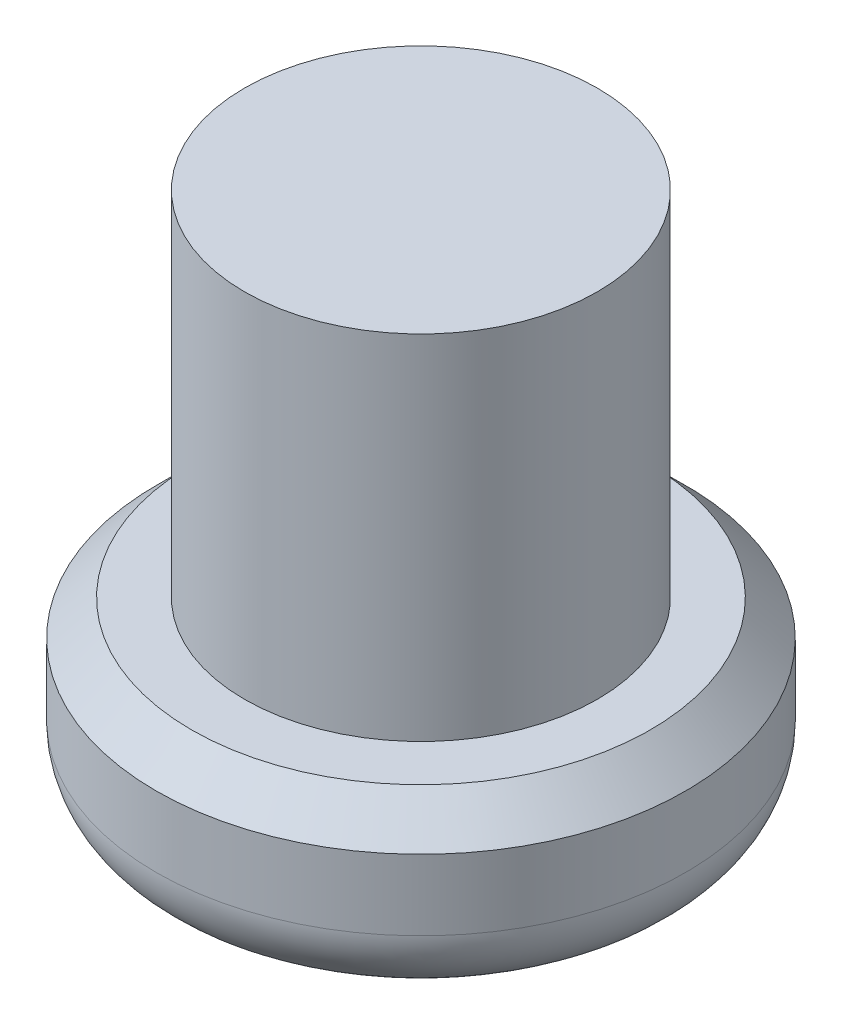
ISO-10303-21;
HEADER;
FILE_DESCRIPTION(('STEP AP214'),'2;1');
FILE_NAME('part.step','',(''),(''),'','','');
FILE_SCHEMA(('AUTOMOTIVE_DESIGN { 1 0 10303 214 1 1 1 1 }'));
ENDSEC;
DATA;
#1=APPLICATION_CONTEXT('core data for automotive mechanical design processes');
#2=APPLICATION_PROTOCOL_DEFINITION('international standard','automotive_design',2000,#1);
#3=PRODUCT_CONTEXT('',#1,'mechanical');
#4=PRODUCT('Part','Part','',(#3));
#5=PRODUCT_RELATED_PRODUCT_CATEGORY('part','',(#4));
#6=PRODUCT_DEFINITION_FORMATION('','',#4);
#7=PRODUCT_DEFINITION_CONTEXT('part definition',#1,'design');
#8=PRODUCT_DEFINITION('design','',#6,#7);
#9=PRODUCT_DEFINITION_SHAPE('','',#8);
#10=(LENGTH_UNIT() NAMED_UNIT(*) SI_UNIT(.MILLI.,.METRE.));
#11=(NAMED_UNIT(*) PLANE_ANGLE_UNIT() SI_UNIT($,.RADIAN.));
#12=(NAMED_UNIT(*) SI_UNIT($,.STERADIAN.) SOLID_ANGLE_UNIT());
#13=UNCERTAINTY_MEASURE_WITH_UNIT(LENGTH_MEASURE(1.E-05),#10,'distance_accuracy_value','');
#14=(GEOMETRIC_REPRESENTATION_CONTEXT(3) GLOBAL_UNCERTAINTY_ASSIGNED_CONTEXT((#13)) GLOBAL_UNIT_ASSIGNED_CONTEXT((#10,
#11,#12)) REPRESENTATION_CONTEXT('',''));
#15=CARTESIAN_POINT('',(0.,0.,0.));
#16=DIRECTION('',(0.,0.,1.));
#17=DIRECTION('',(1.,0.,0.));
#18=AXIS2_PLACEMENT_3D('',#15,#16,#17);
#19=CARTESIAN_POINT('',(0.,5.,0.));
#20=DIRECTION('',(0.,-1.,0.));
#21=DIRECTION('',(0.,0.,-1.));
#22=AXIS2_PLACEMENT_3D('',#19,#20,#21);
#23=CYLINDRICAL_SURFACE('',#22,7.5);
#24=CARTESIAN_POINT('',(0.,3.99999999999999,0.));
#25=DIRECTION('',(0.,1.,0.));
#26=DIRECTION('',(0.,0.,1.));
#27=AXIS2_PLACEMENT_3D('',#24,#25,#26);
#28=CIRCLE('',#27,7.5);
#29=CARTESIAN_POINT('',(0.,3.99999999999999,7.5));
#30=VERTEX_POINT('',#29);
#31=EDGE_CURVE('E10',#30,#30,#28,.F.);
#32=ORIENTED_EDGE('',*,*,#31,.T.);
#33=EDGE_LOOP('',(#32));
#34=FACE_BOUND('',#33,.T.);
#35=CARTESIAN_POINT('',(0.,2.,0.));
#36=DIRECTION('',(0.,1.,0.));
#37=DIRECTION('',(0.,0.,1.));
#38=AXIS2_PLACEMENT_3D('',#35,#36,#37);
#39=CIRCLE('',#38,7.5);
#40=CARTESIAN_POINT('',(0.,2.,7.5));
#41=VERTEX_POINT('',#40);
#42=EDGE_CURVE('E52',#41,#41,#39,.T.);
#43=ORIENTED_EDGE('',*,*,#42,.T.);
#44=EDGE_LOOP('',(#43));
#45=FACE_BOUND('',#44,.T.);
#46=ADVANCED_FACE('F37',(#34,#45),#23,.T.);
#47=CARTESIAN_POINT('',(0.,5.,0.));
#48=DIRECTION('',(0.,1.,0.));
#49=DIRECTION('',(0.,0.,1.));
#50=AXIS2_PLACEMENT_3D('',#47,#48,#49);
#51=PLANE('',#50);
#52=CARTESIAN_POINT('',(0.,5.,0.));
#53=DIRECTION('',(0.,1.,0.));
#54=DIRECTION('',(0.,0.,1.));
#55=AXIS2_PLACEMENT_3D('',#52,#53,#54);
#56=CIRCLE('',#55,6.49999999999999);
#57=CARTESIAN_POINT('',(0.,5.,6.49999999999999));
#58=VERTEX_POINT('',#57);
#59=EDGE_CURVE('E44',#58,#58,#56,.T.);
#60=ORIENTED_EDGE('',*,*,#59,.T.);
#61=EDGE_LOOP('',(#60));
#62=FACE_BOUND('',#61,.T.);
#63=CARTESIAN_POINT('',(0.,5.,0.));
#64=DIRECTION('',(0.,1.,0.));
#65=DIRECTION('',(0.,0.,1.));
#66=AXIS2_PLACEMENT_3D('',#63,#64,#65);
#67=CIRCLE('',#66,5.);
#68=CARTESIAN_POINT('',(0.,5.,5.));
#69=VERTEX_POINT('',#68);
#70=EDGE_CURVE('E58',#69,#69,#67,.T.);
#71=ORIENTED_EDGE('',*,*,#70,.F.);
#72=EDGE_LOOP('',(#71));
#73=FACE_BOUND('',#72,.T.);
#74=ADVANCED_FACE('F73',(#62,#73),#51,.T.);
#75=CARTESIAN_POINT('',(0.,0.,0.));
#76=DIRECTION('',(0.,1.,0.));
#77=DIRECTION('',(0.,0.,1.));
#78=AXIS2_PLACEMENT_3D('',#75,#76,#77);
#79=PLANE('',#78);
#80=CARTESIAN_POINT('',(0.,0.,0.));
#81=DIRECTION('',(0.,1.,0.));
#82=DIRECTION('',(0.,0.,1.));
#83=AXIS2_PLACEMENT_3D('',#80,#81,#82);
#84=CIRCLE('',#83,5.5);
#85=CARTESIAN_POINT('',(0.,0.,5.5));
#86=VERTEX_POINT('',#85);
#87=EDGE_CURVE('E48',#86,#86,#84,.F.);
#88=ORIENTED_EDGE('',*,*,#87,.T.);
#89=EDGE_LOOP('',(#88));
#90=FACE_BOUND('',#89,.T.);
#91=ADVANCED_FACE('F75',(#90),#79,.F.);
#92=CARTESIAN_POINT('',(0.,2.,0.));
#93=DIRECTION('',(0.,1.,0.));
#94=DIRECTION('',(0.,0.,1.));
#95=AXIS2_PLACEMENT_3D('',#92,#93,#94);
#96=TOROIDAL_SURFACE('',#95,5.5,2.);
#97=ORIENTED_EDGE('',*,*,#87,.F.);
#98=EDGE_LOOP('',(#97));
#99=FACE_BOUND('',#98,.T.);
#100=ORIENTED_EDGE('',*,*,#42,.F.);
#101=EDGE_LOOP('',(#100));
#102=FACE_BOUND('',#101,.T.);
#103=ADVANCED_FACE('F69',(#99,#102),#96,.T.);
#104=CARTESIAN_POINT('',(0.,15.,0.));
#105=DIRECTION('',(0.,-1.,0.));
#106=DIRECTION('',(0.,0.,-1.));
#107=AXIS2_PLACEMENT_3D('',#104,#105,#106);
#108=CYLINDRICAL_SURFACE('',#107,5.);
#109=CARTESIAN_POINT('',(0.,15.,0.));
#110=DIRECTION('',(0.,1.,0.));
#111=DIRECTION('',(0.,0.,1.));
#112=AXIS2_PLACEMENT_3D('',#109,#110,#111);
#113=CIRCLE('',#112,5.);
#114=CARTESIAN_POINT('',(0.,15.,5.));
#115=VERTEX_POINT('',#114);
#116=EDGE_CURVE('E57',#115,#115,#113,.T.);
#117=ORIENTED_EDGE('',*,*,#116,.F.);
#118=EDGE_LOOP('',(#117));
#119=FACE_BOUND('',#118,.T.);
#120=ORIENTED_EDGE('',*,*,#70,.T.);
#121=EDGE_LOOP('',(#120));
#122=FACE_BOUND('',#121,.T.);
#123=ADVANCED_FACE('F66',(#119,#122),#108,.T.);
#124=CARTESIAN_POINT('',(0.,15.,0.));
#125=DIRECTION('',(0.,1.,0.));
#126=DIRECTION('',(0.,0.,1.));
#127=AXIS2_PLACEMENT_3D('',#124,#125,#126);
#128=PLANE('',#127);
#129=ORIENTED_EDGE('',*,*,#116,.T.);
#130=EDGE_LOOP('',(#129));
#131=FACE_BOUND('',#130,.T.);
#132=ADVANCED_FACE('F64',(#131),#128,.T.);
#133=CARTESIAN_POINT('',(0.,5.,0.));
#134=DIRECTION('',(0.,-1.,0.));
#135=DIRECTION('',(0.,0.,-1.));
#136=AXIS2_PLACEMENT_3D('',#133,#134,#135);
#137=CONICAL_SURFACE('',#136,6.49999999999999,0.785398163397448);
#138=ORIENTED_EDGE('',*,*,#31,.F.);
#139=EDGE_LOOP('',(#138));
#140=FACE_BOUND('',#139,.T.);
#141=ORIENTED_EDGE('',*,*,#59,.F.);
#142=EDGE_LOOP('',(#141));
#143=FACE_BOUND('',#142,.T.);
#144=ADVANCED_FACE('F39',(#140,#143),#137,.T.);
#145=CLOSED_SHELL('',(#46,#74,#91,#103,#123,#132,#144));
#146=MANIFOLD_SOLID_BREP('B2',#145);
#147=ADVANCED_BREP_SHAPE_REPRESENTATION('',(#18,#146),#14);
#148=SHAPE_DEFINITION_REPRESENTATION(#9,#147);
ENDSEC;
END-ISO-10303-21;
